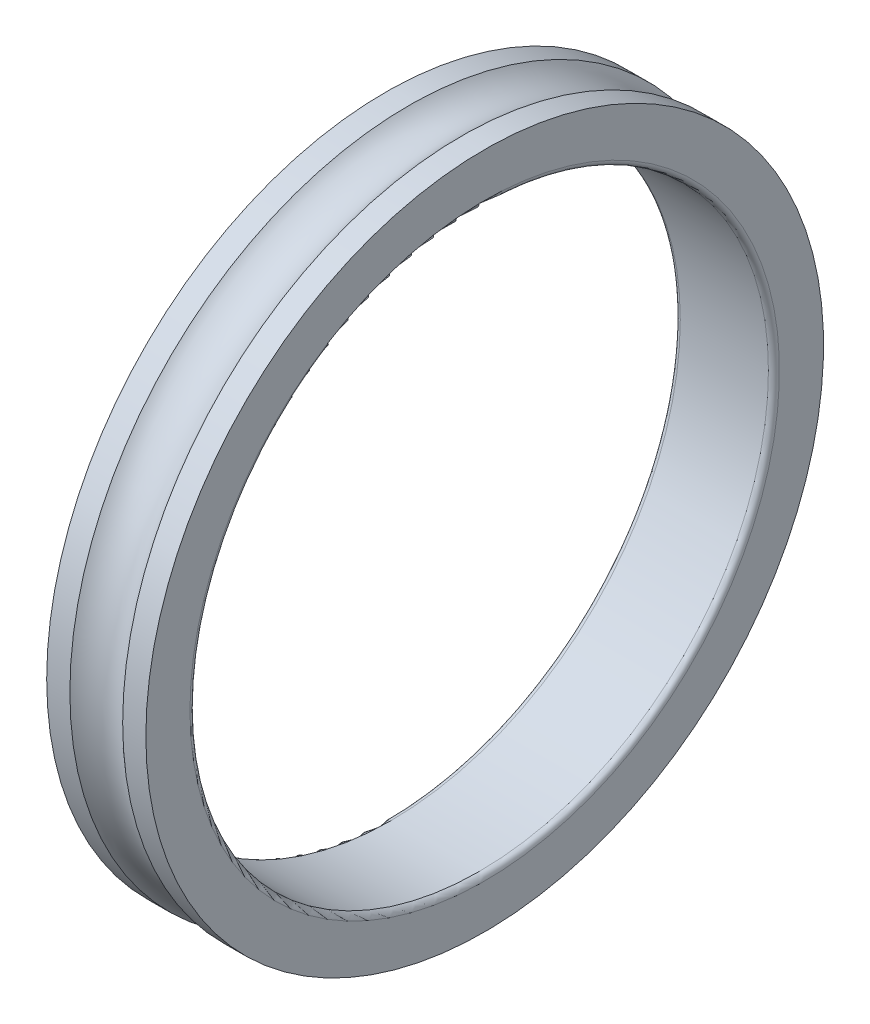
ISO-10303-21;
HEADER;
FILE_DESCRIPTION(('STEP AP214'),'2;1');
FILE_NAME('part.step','',(''),(''),'','','');
FILE_SCHEMA(('AUTOMOTIVE_DESIGN { 1 0 10303 214 1 1 1 1 }'));
ENDSEC;
DATA;
#1=APPLICATION_CONTEXT('core data for automotive mechanical design processes');
#2=APPLICATION_PROTOCOL_DEFINITION('international standard','automotive_design',2000,#1);
#3=PRODUCT_CONTEXT('',#1,'mechanical');
#4=PRODUCT('Part','Part','',(#3));
#5=PRODUCT_RELATED_PRODUCT_CATEGORY('part','',(#4));
#6=PRODUCT_DEFINITION_FORMATION('','',#4);
#7=PRODUCT_DEFINITION_CONTEXT('part definition',#1,'design');
#8=PRODUCT_DEFINITION('design','',#6,#7);
#9=PRODUCT_DEFINITION_SHAPE('','',#8);
#10=(LENGTH_UNIT() NAMED_UNIT(*) SI_UNIT(.MILLI.,.METRE.));
#11=(NAMED_UNIT(*) PLANE_ANGLE_UNIT() SI_UNIT($,.RADIAN.));
#12=(NAMED_UNIT(*) SI_UNIT($,.STERADIAN.) SOLID_ANGLE_UNIT());
#13=UNCERTAINTY_MEASURE_WITH_UNIT(LENGTH_MEASURE(1.E-05),#10,'distance_accuracy_value','');
#14=(GEOMETRIC_REPRESENTATION_CONTEXT(3) GLOBAL_UNCERTAINTY_ASSIGNED_CONTEXT((#13)) GLOBAL_UNIT_ASSIGNED_CONTEXT((#10,
#11,#12)) REPRESENTATION_CONTEXT('',''));
#15=CARTESIAN_POINT('',(0.,0.,0.));
#16=DIRECTION('',(0.,0.,1.));
#17=DIRECTION('',(1.,0.,0.));
#18=AXIS2_PLACEMENT_3D('',#15,#16,#17);
#19=CARTESIAN_POINT('',(0.999999999999232,0.,0.));
#20=DIRECTION('',(-1.,0.,0.));
#21=DIRECTION('',(0.,0.,1.));
#22=AXIS2_PLACEMENT_3D('',#19,#20,#21);
#23=TOROIDAL_SURFACE('',#22,53.4999999999992,0.999999999999231);
#24=CARTESIAN_POINT('',(1.,0.,0.));
#25=DIRECTION('',(-1.,0.,0.));
#26=DIRECTION('',(0.,0.,1.));
#27=AXIS2_PLACEMENT_3D('',#24,#25,#26);
#28=CIRCLE('',#27,52.5);
#29=CARTESIAN_POINT('',(1.,0.,52.5));
#30=VERTEX_POINT('',#29);
#31=EDGE_CURVE('E10',#30,#30,#28,.T.);
#32=ORIENTED_EDGE('',*,*,#31,.F.);
#33=EDGE_LOOP('',(#32));
#34=FACE_BOUND('',#33,.T.);
#35=CARTESIAN_POINT('',(0.,0.,0.));
#36=DIRECTION('',(-1.,0.,0.));
#37=DIRECTION('',(0.,0.,1.));
#38=AXIS2_PLACEMENT_3D('',#35,#36,#37);
#39=CIRCLE('',#38,53.5);
#40=CARTESIAN_POINT('',(0.,0.,53.5));
#41=VERTEX_POINT('',#40);
#42=EDGE_CURVE('E59',#41,#41,#39,.T.);
#43=ORIENTED_EDGE('',*,*,#42,.T.);
#44=EDGE_LOOP('',(#43));
#45=FACE_BOUND('',#44,.T.);
#46=ADVANCED_FACE('F31',(#34,#45),#23,.T.);
#47=CARTESIAN_POINT('',(50.,0.,0.));
#48=DIRECTION('',(-1.,0.,0.));
#49=DIRECTION('',(0.,0.,1.));
#50=AXIS2_PLACEMENT_3D('',#47,#48,#49);
#51=CYLINDRICAL_SURFACE('',#50,52.5);
#52=CARTESIAN_POINT('',(17.,0.,0.));
#53=DIRECTION('',(-1.,0.,0.));
#54=DIRECTION('',(0.,0.,1.));
#55=AXIS2_PLACEMENT_3D('',#52,#53,#54);
#56=CIRCLE('',#55,52.5);
#57=CARTESIAN_POINT('',(17.,0.,52.5));
#58=VERTEX_POINT('',#57);
#59=EDGE_CURVE('E37',#58,#58,#56,.T.);
#60=ORIENTED_EDGE('',*,*,#59,.F.);
#61=EDGE_LOOP('',(#60));
#62=FACE_BOUND('',#61,.T.);
#63=ORIENTED_EDGE('',*,*,#31,.T.);
#64=EDGE_LOOP('',(#63));
#65=FACE_BOUND('',#64,.T.);
#66=ADVANCED_FACE('F96',(#62,#65),#51,.F.);
#67=CARTESIAN_POINT('',(17.0000000000015,0.,0.));
#68=DIRECTION('',(-1.,0.,0.));
#69=DIRECTION('',(0.,0.,1.));
#70=AXIS2_PLACEMENT_3D('',#67,#68,#69);
#71=TOROIDAL_SURFACE('',#70,53.4999999999985,0.999999999998455);
#72=CARTESIAN_POINT('',(18.,0.,0.));
#73=DIRECTION('',(-1.,0.,0.));
#74=DIRECTION('',(0.,0.,1.));
#75=AXIS2_PLACEMENT_3D('',#72,#73,#74);
#76=CIRCLE('',#75,53.5);
#77=CARTESIAN_POINT('',(18.,0.,53.5));
#78=VERTEX_POINT('',#77);
#79=EDGE_CURVE('E41',#78,#78,#76,.T.);
#80=ORIENTED_EDGE('',*,*,#79,.F.);
#81=EDGE_LOOP('',(#80));
#82=FACE_BOUND('',#81,.T.);
#83=ORIENTED_EDGE('',*,*,#59,.T.);
#84=EDGE_LOOP('',(#83));
#85=FACE_BOUND('',#84,.T.);
#86=ADVANCED_FACE('F91',(#82,#85),#71,.T.);
#87=CARTESIAN_POINT('',(18.,53.5,0.));
#88=DIRECTION('',(-1.,0.,0.));
#89=DIRECTION('',(0.,0.,1.));
#90=AXIS2_PLACEMENT_3D('',#87,#88,#89);
#91=PLANE('',#90);
#92=CARTESIAN_POINT('',(18.,0.,0.));
#93=DIRECTION('',(-1.,0.,0.));
#94=DIRECTION('',(0.,0.,1.));
#95=AXIS2_PLACEMENT_3D('',#92,#93,#94);
#96=CIRCLE('',#95,61.5);
#97=CARTESIAN_POINT('',(18.,0.,61.5));
#98=VERTEX_POINT('',#97);
#99=EDGE_CURVE('E45',#98,#98,#96,.T.);
#100=ORIENTED_EDGE('',*,*,#99,.F.);
#101=EDGE_LOOP('',(#100));
#102=FACE_BOUND('',#101,.T.);
#103=ORIENTED_EDGE('',*,*,#79,.T.);
#104=EDGE_LOOP('',(#103));
#105=FACE_BOUND('',#104,.T.);
#106=ADVANCED_FACE('F85',(#102,#105),#91,.F.);
#107=CARTESIAN_POINT('',(50.,0.,0.));
#108=DIRECTION('',(-1.,0.,0.));
#109=DIRECTION('',(0.,0.,1.));
#110=AXIS2_PLACEMENT_3D('',#107,#108,#109);
#111=CYLINDRICAL_SURFACE('',#110,61.5);
#112=CARTESIAN_POINT('',(13.79160818515,0.,0.));
#113=DIRECTION('',(-1.,0.,0.));
#114=DIRECTION('',(0.,0.,1.));
#115=AXIS2_PLACEMENT_3D('',#112,#113,#114);
#116=CIRCLE('',#115,61.5);
#117=CARTESIAN_POINT('',(13.79160818515,0.,61.5));
#118=VERTEX_POINT('',#117);
#119=EDGE_CURVE('E50',#118,#118,#116,.T.);
#120=ORIENTED_EDGE('',*,*,#119,.F.);
#121=EDGE_LOOP('',(#120));
#122=FACE_BOUND('',#121,.T.);
#123=ORIENTED_EDGE('',*,*,#99,.T.);
#124=EDGE_LOOP('',(#123));
#125=FACE_BOUND('',#124,.T.);
#126=ADVANCED_FACE('F79',(#122,#125),#111,.T.);
#127=CARTESIAN_POINT('',(8.9999999999998,0.,0.));
#128=DIRECTION('',(-1.,0.,0.));
#129=DIRECTION('',(0.,0.,1.));
#130=AXIS2_PLACEMENT_3D('',#127,#128,#129);
#131=TOROIDAL_SURFACE('',#130,66.2499999999996,6.7469999999996);
#132=CARTESIAN_POINT('',(4.2083918148496,0.,0.));
#133=DIRECTION('',(-1.,0.,0.));
#134=DIRECTION('',(0.,0.,1.));
#135=AXIS2_PLACEMENT_3D('',#132,#133,#134);
#136=CIRCLE('',#135,61.5);
#137=CARTESIAN_POINT('',(4.2083918148496,0.,61.5));
#138=VERTEX_POINT('',#137);
#139=EDGE_CURVE('E53',#138,#138,#136,.T.);
#140=ORIENTED_EDGE('',*,*,#139,.F.);
#141=EDGE_LOOP('',(#140));
#142=FACE_BOUND('',#141,.T.);
#143=ORIENTED_EDGE('',*,*,#119,.T.);
#144=EDGE_LOOP('',(#143));
#145=FACE_BOUND('',#144,.T.);
#146=ADVANCED_FACE('F73',(#142,#145),#131,.F.);
#147=CARTESIAN_POINT('',(50.,0.,0.));
#148=DIRECTION('',(-1.,0.,0.));
#149=DIRECTION('',(0.,0.,1.));
#150=AXIS2_PLACEMENT_3D('',#147,#148,#149);
#151=CYLINDRICAL_SURFACE('',#150,61.5);
#152=CARTESIAN_POINT('',(0.,0.,0.));
#153=DIRECTION('',(-1.,0.,0.));
#154=DIRECTION('',(0.,0.,1.));
#155=AXIS2_PLACEMENT_3D('',#152,#153,#154);
#156=CIRCLE('',#155,61.5);
#157=CARTESIAN_POINT('',(0.,0.,61.5));
#158=VERTEX_POINT('',#157);
#159=EDGE_CURVE('E56',#158,#158,#156,.T.);
#160=ORIENTED_EDGE('',*,*,#159,.F.);
#161=EDGE_LOOP('',(#160));
#162=FACE_BOUND('',#161,.T.);
#163=ORIENTED_EDGE('',*,*,#139,.T.);
#164=EDGE_LOOP('',(#163));
#165=FACE_BOUND('',#164,.T.);
#166=ADVANCED_FACE('F67',(#162,#165),#151,.T.);
#167=CARTESIAN_POINT('',(0.,61.5,0.));
#168=DIRECTION('',(1.,0.,0.));
#169=DIRECTION('',(0.,0.,-1.));
#170=AXIS2_PLACEMENT_3D('',#167,#168,#169);
#171=PLANE('',#170);
#172=ORIENTED_EDGE('',*,*,#42,.F.);
#173=EDGE_LOOP('',(#172));
#174=FACE_BOUND('',#173,.T.);
#175=ORIENTED_EDGE('',*,*,#159,.T.);
#176=EDGE_LOOP('',(#175));
#177=FACE_BOUND('',#176,.T.);
#178=ADVANCED_FACE('F64',(#174,#177),#171,.F.);
#179=CLOSED_SHELL('',(#46,#66,#86,#106,#126,#146,#166,#178));
#180=MANIFOLD_SOLID_BREP('B2',#179);
#181=ADVANCED_BREP_SHAPE_REPRESENTATION('',(#18,#180),#14);
#182=SHAPE_DEFINITION_REPRESENTATION(#9,#181);
ENDSEC;
END-ISO-10303-21;
